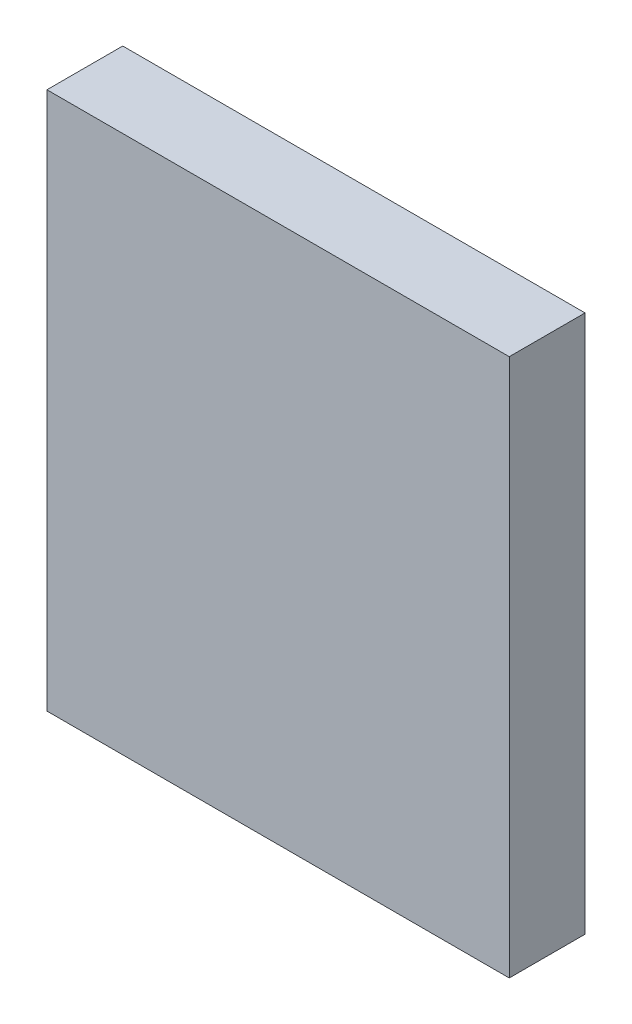
ISO-10303-21;
HEADER;
FILE_DESCRIPTION(('STEP AP214'),'2;1');
FILE_NAME('part.step','',(''),(''),'','','');
FILE_SCHEMA(('AUTOMOTIVE_DESIGN { 1 0 10303 214 1 1 1 1 }'));
ENDSEC;
DATA;
#1=APPLICATION_CONTEXT('core data for automotive mechanical design processes');
#2=APPLICATION_PROTOCOL_DEFINITION('international standard','automotive_design',2000,#1);
#3=PRODUCT_CONTEXT('',#1,'mechanical');
#4=PRODUCT('Part','Part','',(#3));
#5=PRODUCT_RELATED_PRODUCT_CATEGORY('part','',(#4));
#6=PRODUCT_DEFINITION_FORMATION('','',#4);
#7=PRODUCT_DEFINITION_CONTEXT('part definition',#1,'design');
#8=PRODUCT_DEFINITION('design','',#6,#7);
#9=PRODUCT_DEFINITION_SHAPE('','',#8);
#10=(LENGTH_UNIT() NAMED_UNIT(*) SI_UNIT(.MILLI.,.METRE.));
#11=(NAMED_UNIT(*) PLANE_ANGLE_UNIT() SI_UNIT($,.RADIAN.));
#12=(NAMED_UNIT(*) SI_UNIT($,.STERADIAN.) SOLID_ANGLE_UNIT());
#13=UNCERTAINTY_MEASURE_WITH_UNIT(LENGTH_MEASURE(1.E-05),#10,'distance_accuracy_value','');
#14=(GEOMETRIC_REPRESENTATION_CONTEXT(3) GLOBAL_UNCERTAINTY_ASSIGNED_CONTEXT((#13)) GLOBAL_UNIT_ASSIGNED_CONTEXT((#10,
#11,#12)) REPRESENTATION_CONTEXT('',''));
#15=CARTESIAN_POINT('',(0.,0.,0.));
#16=DIRECTION('',(0.,0.,1.));
#17=DIRECTION('',(1.,0.,0.));
#18=AXIS2_PLACEMENT_3D('',#15,#16,#17);
#19=CARTESIAN_POINT('',(3.05,3.55,1.));
#20=DIRECTION('',(0.,-1.,0.));
#21=DIRECTION('',(0.,0.,-1.));
#22=AXIS2_PLACEMENT_3D('',#19,#20,#21);
#23=PLANE('',#22);
#24=DIRECTION('',(-1.,0.,0.));
#25=VECTOR('',#24,1.);
#26=CARTESIAN_POINT('',(3.05,3.55,0.));
#27=LINE('',#26,#25);
#28=CARTESIAN_POINT('',(3.05,3.55,0.));
#29=VERTEX_POINT('',#28);
#30=CARTESIAN_POINT('',(-3.05,3.55,0.));
#31=VERTEX_POINT('',#30);
#32=EDGE_CURVE('E97',#29,#31,#27,.T.);
#33=ORIENTED_EDGE('',*,*,#32,.T.);
#34=DIRECTION('',(0.,0.,-1.));
#35=VECTOR('',#34,1.);
#36=CARTESIAN_POINT('',(-3.05,3.55,1.));
#37=LINE('',#36,#35);
#38=CARTESIAN_POINT('',(-3.05,3.55,1.));
#39=VERTEX_POINT('',#38);
#40=EDGE_CURVE('E11',#39,#31,#37,.T.);
#41=ORIENTED_EDGE('',*,*,#40,.F.);
#42=DIRECTION('',(-1.,0.,0.));
#43=VECTOR('',#42,1.);
#44=CARTESIAN_POINT('',(3.05,3.55,1.));
#45=LINE('',#44,#43);
#46=CARTESIAN_POINT('',(3.05,3.55,1.));
#47=VERTEX_POINT('',#46);
#48=EDGE_CURVE('E85',#47,#39,#45,.T.);
#49=ORIENTED_EDGE('',*,*,#48,.F.);
#50=DIRECTION('',(0.,0.,-1.));
#51=VECTOR('',#50,1.);
#52=CARTESIAN_POINT('',(3.05,3.55,1.));
#53=LINE('',#52,#51);
#54=EDGE_CURVE('E93',#47,#29,#53,.T.);
#55=ORIENTED_EDGE('',*,*,#54,.T.);
#56=EDGE_LOOP('',(#33,#41,#49,#55));
#57=FACE_BOUND('',#56,.T.);
#58=ADVANCED_FACE('F34',(#57),#23,.F.);
#59=CARTESIAN_POINT('',(-3.05,3.55,1.));
#60=DIRECTION('',(1.,0.,0.));
#61=DIRECTION('',(0.,0.,-1.));
#62=AXIS2_PLACEMENT_3D('',#59,#60,#61);
#63=PLANE('',#62);
#64=DIRECTION('',(0.,-1.,0.));
#65=VECTOR('',#64,1.);
#66=CARTESIAN_POINT('',(-3.05,3.55,0.));
#67=LINE('',#66,#65);
#68=CARTESIAN_POINT('',(-3.05,-3.55,0.));
#69=VERTEX_POINT('',#68);
#70=EDGE_CURVE('E89',#31,#69,#67,.T.);
#71=ORIENTED_EDGE('',*,*,#70,.T.);
#72=DIRECTION('',(0.,0.,-1.));
#73=VECTOR('',#72,1.);
#74=CARTESIAN_POINT('',(-3.05,-3.55,1.));
#75=LINE('',#74,#73);
#76=CARTESIAN_POINT('',(-3.05,-3.55,1.));
#77=VERTEX_POINT('',#76);
#78=EDGE_CURVE('E42',#77,#69,#75,.T.);
#79=ORIENTED_EDGE('',*,*,#78,.F.);
#80=DIRECTION('',(0.,-1.,0.));
#81=VECTOR('',#80,1.);
#82=CARTESIAN_POINT('',(-3.05,3.55,1.));
#83=LINE('',#82,#81);
#84=EDGE_CURVE('E80',#39,#77,#83,.T.);
#85=ORIENTED_EDGE('',*,*,#84,.F.);
#86=ORIENTED_EDGE('',*,*,#40,.T.);
#87=EDGE_LOOP('',(#71,#79,#85,#86));
#88=FACE_BOUND('',#87,.T.);
#89=ADVANCED_FACE('F88',(#88),#63,.F.);
#90=CARTESIAN_POINT('',(-3.05,-3.55,1.));
#91=DIRECTION('',(0.,1.,0.));
#92=DIRECTION('',(0.,0.,1.));
#93=AXIS2_PLACEMENT_3D('',#90,#91,#92);
#94=PLANE('',#93);
#95=DIRECTION('',(1.,0.,0.));
#96=VECTOR('',#95,1.);
#97=CARTESIAN_POINT('',(-3.05,-3.55,0.));
#98=LINE('',#97,#96);
#99=CARTESIAN_POINT('',(3.05,-3.55,0.));
#100=VERTEX_POINT('',#99);
#101=EDGE_CURVE('E67',#69,#100,#98,.T.);
#102=ORIENTED_EDGE('',*,*,#101,.T.);
#103=DIRECTION('',(0.,0.,-1.));
#104=VECTOR('',#103,1.);
#105=CARTESIAN_POINT('',(3.05,-3.55,1.));
#106=LINE('',#105,#104);
#107=CARTESIAN_POINT('',(3.05,-3.55,1.));
#108=VERTEX_POINT('',#107);
#109=EDGE_CURVE('E90',#108,#100,#106,.T.);
#110=ORIENTED_EDGE('',*,*,#109,.F.);
#111=DIRECTION('',(1.,0.,0.));
#112=VECTOR('',#111,1.);
#113=CARTESIAN_POINT('',(-3.05,-3.55,1.));
#114=LINE('',#113,#112);
#115=EDGE_CURVE('E83',#77,#108,#114,.T.);
#116=ORIENTED_EDGE('',*,*,#115,.F.);
#117=ORIENTED_EDGE('',*,*,#78,.T.);
#118=EDGE_LOOP('',(#102,#110,#116,#117));
#119=FACE_BOUND('',#118,.T.);
#120=ADVANCED_FACE('F91',(#119),#94,.F.);
#121=CARTESIAN_POINT('',(3.05,-3.55,1.));
#122=DIRECTION('',(-1.,0.,0.));
#123=DIRECTION('',(0.,0.,1.));
#124=AXIS2_PLACEMENT_3D('',#121,#122,#123);
#125=PLANE('',#124);
#126=DIRECTION('',(0.,1.,0.));
#127=VECTOR('',#126,1.);
#128=CARTESIAN_POINT('',(3.05,-3.55,0.));
#129=LINE('',#128,#127);
#130=EDGE_CURVE('E73',#100,#29,#129,.T.);
#131=ORIENTED_EDGE('',*,*,#130,.T.);
#132=ORIENTED_EDGE('',*,*,#54,.F.);
#133=DIRECTION('',(0.,1.,0.));
#134=VECTOR('',#133,1.);
#135=CARTESIAN_POINT('',(3.05,-3.55,1.));
#136=LINE('',#135,#134);
#137=EDGE_CURVE('E50',#108,#47,#136,.T.);
#138=ORIENTED_EDGE('',*,*,#137,.F.);
#139=ORIENTED_EDGE('',*,*,#109,.T.);
#140=EDGE_LOOP('',(#131,#132,#138,#139));
#141=FACE_BOUND('',#140,.T.);
#142=ADVANCED_FACE('F104',(#141),#125,.F.);
#143=CARTESIAN_POINT('',(0.,0.,1.));
#144=DIRECTION('',(0.,0.,1.));
#145=DIRECTION('',(1.,0.,0.));
#146=AXIS2_PLACEMENT_3D('',#143,#144,#145);
#147=PLANE('',#146);
#148=ORIENTED_EDGE('',*,*,#48,.T.);
#149=ORIENTED_EDGE('',*,*,#84,.T.);
#150=ORIENTED_EDGE('',*,*,#115,.T.);
#151=ORIENTED_EDGE('',*,*,#137,.T.);
#152=EDGE_LOOP('',(#148,#149,#150,#151));
#153=FACE_BOUND('',#152,.T.);
#154=ADVANCED_FACE('F81',(#153),#147,.T.);
#155=CARTESIAN_POINT('',(0.,0.,0.));
#156=DIRECTION('',(0.,0.,1.));
#157=DIRECTION('',(1.,0.,0.));
#158=AXIS2_PLACEMENT_3D('',#155,#156,#157);
#159=PLANE('',#158);
#160=ORIENTED_EDGE('',*,*,#32,.F.);
#161=ORIENTED_EDGE('',*,*,#130,.F.);
#162=ORIENTED_EDGE('',*,*,#101,.F.);
#163=ORIENTED_EDGE('',*,*,#70,.F.);
#164=EDGE_LOOP('',(#160,#161,#162,#163));
#165=FACE_BOUND('',#164,.T.);
#166=ADVANCED_FACE('F107',(#165),#159,.F.);
#167=CLOSED_SHELL('',(#58,#89,#120,#142,#154,#166));
#168=MANIFOLD_SOLID_BREP('B2',#167);
#169=ADVANCED_BREP_SHAPE_REPRESENTATION('',(#18,#168),#14);
#170=SHAPE_DEFINITION_REPRESENTATION(#9,#169);
ENDSEC;
END-ISO-10303-21;
